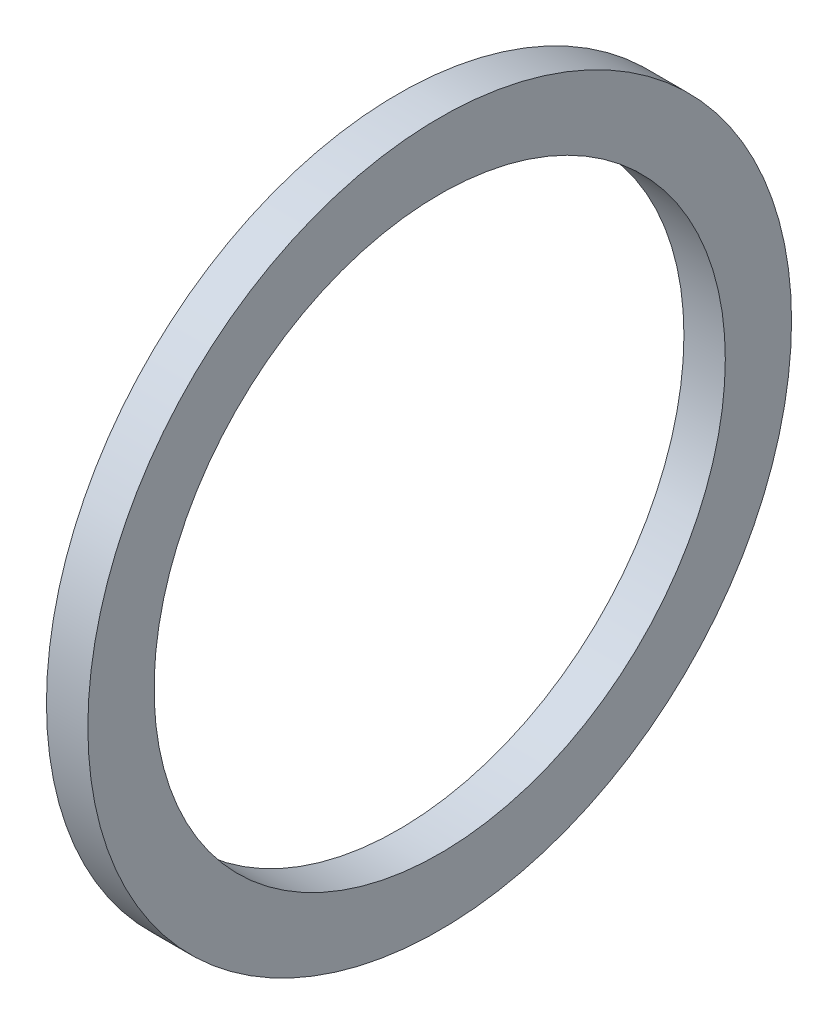
ISO-10303-21;
HEADER;
FILE_DESCRIPTION(('STEP AP214'),'2;1');
FILE_NAME('part.step','',(''),(''),'','','');
FILE_SCHEMA(('AUTOMOTIVE_DESIGN { 1 0 10303 214 1 1 1 1 }'));
ENDSEC;
DATA;
#1=APPLICATION_CONTEXT('core data for automotive mechanical design processes');
#2=APPLICATION_PROTOCOL_DEFINITION('international standard','automotive_design',2000,#1);
#3=PRODUCT_CONTEXT('',#1,'mechanical');
#4=PRODUCT('Part','Part','',(#3));
#5=PRODUCT_RELATED_PRODUCT_CATEGORY('part','',(#4));
#6=PRODUCT_DEFINITION_FORMATION('','',#4);
#7=PRODUCT_DEFINITION_CONTEXT('part definition',#1,'design');
#8=PRODUCT_DEFINITION('design','',#6,#7);
#9=PRODUCT_DEFINITION_SHAPE('','',#8);
#10=(LENGTH_UNIT() NAMED_UNIT(*) SI_UNIT(.MILLI.,.METRE.));
#11=(NAMED_UNIT(*) PLANE_ANGLE_UNIT() SI_UNIT($,.RADIAN.));
#12=(NAMED_UNIT(*) SI_UNIT($,.STERADIAN.) SOLID_ANGLE_UNIT());
#13=UNCERTAINTY_MEASURE_WITH_UNIT(LENGTH_MEASURE(1.E-05),#10,'distance_accuracy_value','');
#14=(GEOMETRIC_REPRESENTATION_CONTEXT(3) GLOBAL_UNCERTAINTY_ASSIGNED_CONTEXT((#13)) GLOBAL_UNIT_ASSIGNED_CONTEXT((#10,
#11,#12)) REPRESENTATION_CONTEXT('',''));
#15=CARTESIAN_POINT('',(0.,0.,0.));
#16=DIRECTION('',(0.,0.,1.));
#17=DIRECTION('',(1.,0.,0.));
#18=AXIS2_PLACEMENT_3D('',#15,#16,#17);
#19=CARTESIAN_POINT('',(1.,0.,0.));
#20=DIRECTION('',(1.,0.,0.));
#21=DIRECTION('',(0.,0.,-1.));
#22=AXIS2_PLACEMENT_3D('',#19,#20,#21);
#23=PLANE('',#22);
#24=CARTESIAN_POINT('',(1.,0.,0.));
#25=DIRECTION('',(1.,0.,0.));
#26=DIRECTION('',(0.,0.,-1.));
#27=AXIS2_PLACEMENT_3D('',#24,#25,#26);
#28=CIRCLE('',#27,8.5);
#29=CARTESIAN_POINT('',(1.,0.,-8.5));
#30=VERTEX_POINT('',#29);
#31=EDGE_CURVE('E10',#30,#30,#28,.T.);
#32=ORIENTED_EDGE('',*,*,#31,.T.);
#33=EDGE_LOOP('',(#32));
#34=FACE_BOUND('',#33,.T.);
#35=CARTESIAN_POINT('',(1.,0.,0.));
#36=DIRECTION('',(1.,0.,0.));
#37=DIRECTION('',(0.,0.,-1.));
#38=AXIS2_PLACEMENT_3D('',#35,#36,#37);
#39=CIRCLE('',#38,6.9);
#40=CARTESIAN_POINT('',(1.,0.,-6.9));
#41=VERTEX_POINT('',#40);
#42=EDGE_CURVE('E42',#41,#41,#39,.T.);
#43=ORIENTED_EDGE('',*,*,#42,.F.);
#44=EDGE_LOOP('',(#43));
#45=FACE_BOUND('',#44,.T.);
#46=ADVANCED_FACE('F31',(#34,#45),#23,.T.);
#47=CARTESIAN_POINT('',(0.,0.,0.));
#48=DIRECTION('',(1.,0.,0.));
#49=DIRECTION('',(0.,0.,-1.));
#50=AXIS2_PLACEMENT_3D('',#47,#48,#49);
#51=PLANE('',#50);
#52=CARTESIAN_POINT('',(0.,0.,0.));
#53=DIRECTION('',(1.,0.,0.));
#54=DIRECTION('',(0.,0.,-1.));
#55=AXIS2_PLACEMENT_3D('',#52,#53,#54);
#56=CIRCLE('',#55,8.5);
#57=CARTESIAN_POINT('',(0.,0.,-8.5));
#58=VERTEX_POINT('',#57);
#59=EDGE_CURVE('E35',#58,#58,#56,.T.);
#60=ORIENTED_EDGE('',*,*,#59,.F.);
#61=EDGE_LOOP('',(#60));
#62=FACE_BOUND('',#61,.T.);
#63=CARTESIAN_POINT('',(0.,0.,0.));
#64=DIRECTION('',(1.,0.,0.));
#65=DIRECTION('',(0.,0.,-1.));
#66=AXIS2_PLACEMENT_3D('',#63,#64,#65);
#67=CIRCLE('',#66,6.9);
#68=CARTESIAN_POINT('',(0.,0.,-6.9));
#69=VERTEX_POINT('',#68);
#70=EDGE_CURVE('E44',#69,#69,#67,.T.);
#71=ORIENTED_EDGE('',*,*,#70,.T.);
#72=EDGE_LOOP('',(#71));
#73=FACE_BOUND('',#72,.T.);
#74=ADVANCED_FACE('F54',(#62,#73),#51,.F.);
#75=CARTESIAN_POINT('',(1.,0.,0.));
#76=DIRECTION('',(-1.,0.,0.));
#77=DIRECTION('',(0.,0.,1.));
#78=AXIS2_PLACEMENT_3D('',#75,#76,#77);
#79=CYLINDRICAL_SURFACE('',#78,8.5);
#80=ORIENTED_EDGE('',*,*,#31,.F.);
#81=EDGE_LOOP('',(#80));
#82=FACE_BOUND('',#81,.T.);
#83=ORIENTED_EDGE('',*,*,#59,.T.);
#84=EDGE_LOOP('',(#83));
#85=FACE_BOUND('',#84,.T.);
#86=ADVANCED_FACE('F33',(#82,#85),#79,.T.);
#87=CARTESIAN_POINT('',(1.,0.,0.));
#88=DIRECTION('',(-1.,0.,0.));
#89=DIRECTION('',(0.,0.,1.));
#90=AXIS2_PLACEMENT_3D('',#87,#88,#89);
#91=CYLINDRICAL_SURFACE('',#90,6.9);
#92=ORIENTED_EDGE('',*,*,#42,.T.);
#93=EDGE_LOOP('',(#92));
#94=FACE_BOUND('',#93,.T.);
#95=ORIENTED_EDGE('',*,*,#70,.F.);
#96=EDGE_LOOP('',(#95));
#97=FACE_BOUND('',#96,.T.);
#98=ADVANCED_FACE('F50',(#94,#97),#91,.F.);
#99=CLOSED_SHELL('',(#46,#74,#86,#98));
#100=MANIFOLD_SOLID_BREP('B2',#99);
#101=ADVANCED_BREP_SHAPE_REPRESENTATION('',(#18,#100),#14);
#102=SHAPE_DEFINITION_REPRESENTATION(#9,#101);
ENDSEC;
END-ISO-10303-21;
